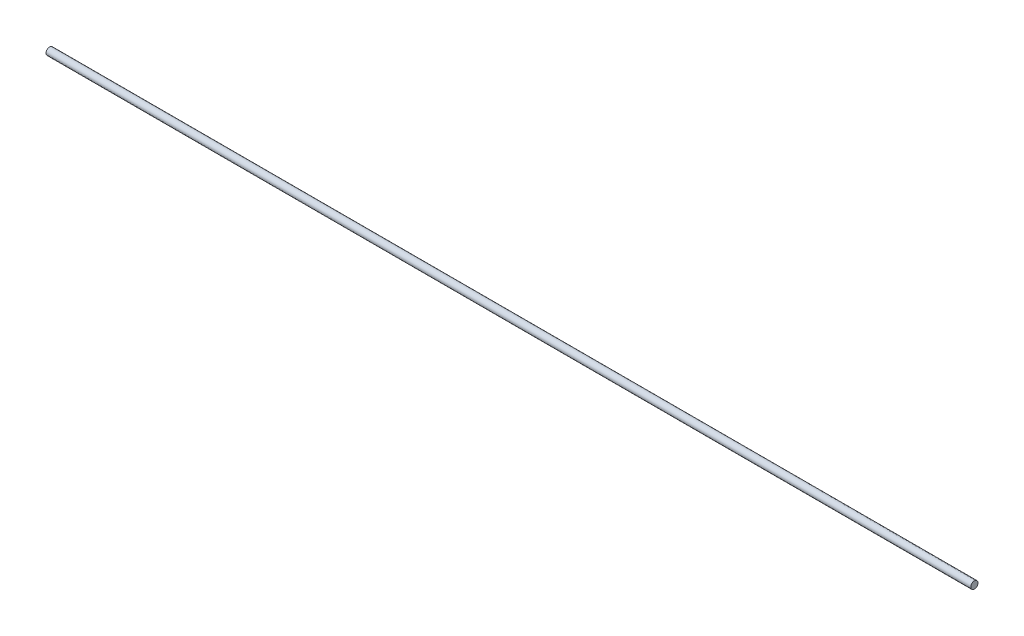
ISO-10303-21;
HEADER;
FILE_DESCRIPTION(('STEP AP214'),'2;1');
FILE_NAME('part.step','',(''),(''),'','','');
FILE_SCHEMA(('AUTOMOTIVE_DESIGN { 1 0 10303 214 1 1 1 1 }'));
ENDSEC;
DATA;
#1=APPLICATION_CONTEXT('core data for automotive mechanical design processes');
#2=APPLICATION_PROTOCOL_DEFINITION('international standard','automotive_design',2000,#1);
#3=PRODUCT_CONTEXT('',#1,'mechanical');
#4=PRODUCT('Part','Part','',(#3));
#5=PRODUCT_RELATED_PRODUCT_CATEGORY('part','',(#4));
#6=PRODUCT_DEFINITION_FORMATION('','',#4);
#7=PRODUCT_DEFINITION_CONTEXT('part definition',#1,'design');
#8=PRODUCT_DEFINITION('design','',#6,#7);
#9=PRODUCT_DEFINITION_SHAPE('','',#8);
#10=(LENGTH_UNIT() NAMED_UNIT(*) SI_UNIT(.MILLI.,.METRE.));
#11=(NAMED_UNIT(*) PLANE_ANGLE_UNIT() SI_UNIT($,.RADIAN.));
#12=(NAMED_UNIT(*) SI_UNIT($,.STERADIAN.) SOLID_ANGLE_UNIT());
#13=UNCERTAINTY_MEASURE_WITH_UNIT(LENGTH_MEASURE(1.E-05),#10,'distance_accuracy_value','');
#14=(GEOMETRIC_REPRESENTATION_CONTEXT(3) GLOBAL_UNCERTAINTY_ASSIGNED_CONTEXT((#13)) GLOBAL_UNIT_ASSIGNED_CONTEXT((#10,
#11,#12)) REPRESENTATION_CONTEXT('',''));
#15=CARTESIAN_POINT('',(0.,0.,0.));
#16=DIRECTION('',(0.,0.,1.));
#17=DIRECTION('',(1.,0.,0.));
#18=AXIS2_PLACEMENT_3D('',#15,#16,#17);
#19=CARTESIAN_POINT('',(812.8,16.2262414710301,-4.7956111171722));
#20=DIRECTION('',(-1.,0.,0.));
#21=DIRECTION('',(0.,0.,1.));
#22=AXIS2_PLACEMENT_3D('',#19,#20,#21);
#23=CYLINDRICAL_SURFACE('',#22,3.175);
#24=CARTESIAN_POINT('',(812.8,16.2262414710301,-4.7956111171722));
#25=DIRECTION('',(1.,0.,0.));
#26=DIRECTION('',(0.,0.,-1.));
#27=AXIS2_PLACEMENT_3D('',#24,#25,#26);
#28=CIRCLE('',#27,3.175);
#29=CARTESIAN_POINT('',(812.8,16.2262414710301,-7.9706111171722));
#30=VERTEX_POINT('',#29);
#31=EDGE_CURVE('E10',#30,#30,#28,.T.);
#32=ORIENTED_EDGE('',*,*,#31,.F.);
#33=EDGE_LOOP('',(#32));
#34=FACE_BOUND('',#33,.T.);
#35=CARTESIAN_POINT('',(0.,16.2262414710301,-4.7956111171722));
#36=DIRECTION('',(1.,0.,0.));
#37=DIRECTION('',(0.,0.,-1.));
#38=AXIS2_PLACEMENT_3D('',#35,#36,#37);
#39=CIRCLE('',#38,3.175);
#40=CARTESIAN_POINT('',(0.,16.2262414710301,-7.9706111171722));
#41=VERTEX_POINT('',#40);
#42=EDGE_CURVE('E36',#41,#41,#39,.T.);
#43=ORIENTED_EDGE('',*,*,#42,.T.);
#44=EDGE_LOOP('',(#43));
#45=FACE_BOUND('',#44,.T.);
#46=ADVANCED_FACE('F33',(#34,#45),#23,.T.);
#47=CARTESIAN_POINT('',(812.8,16.2262414710301,-4.7956111171722));
#48=DIRECTION('',(1.,0.,0.));
#49=DIRECTION('',(0.,0.,-1.));
#50=AXIS2_PLACEMENT_3D('',#47,#48,#49);
#51=PLANE('',#50);
#52=ORIENTED_EDGE('',*,*,#31,.T.);
#53=EDGE_LOOP('',(#52));
#54=FACE_BOUND('',#53,.T.);
#55=ADVANCED_FACE('F48',(#54),#51,.T.);
#56=CARTESIAN_POINT('',(0.,16.2262414710301,-4.7956111171722));
#57=DIRECTION('',(1.,0.,0.));
#58=DIRECTION('',(0.,0.,-1.));
#59=AXIS2_PLACEMENT_3D('',#56,#57,#58);
#60=PLANE('',#59);
#61=ORIENTED_EDGE('',*,*,#42,.F.);
#62=EDGE_LOOP('',(#61));
#63=FACE_BOUND('',#62,.T.);
#64=ADVANCED_FACE('F46',(#63),#60,.F.);
#65=CLOSED_SHELL('',(#46,#55,#64));
#66=MANIFOLD_SOLID_BREP('B2',#65);
#67=ADVANCED_BREP_SHAPE_REPRESENTATION('',(#18,#66),#14);
#68=SHAPE_DEFINITION_REPRESENTATION(#9,#67);
ENDSEC;
END-ISO-10303-21;
